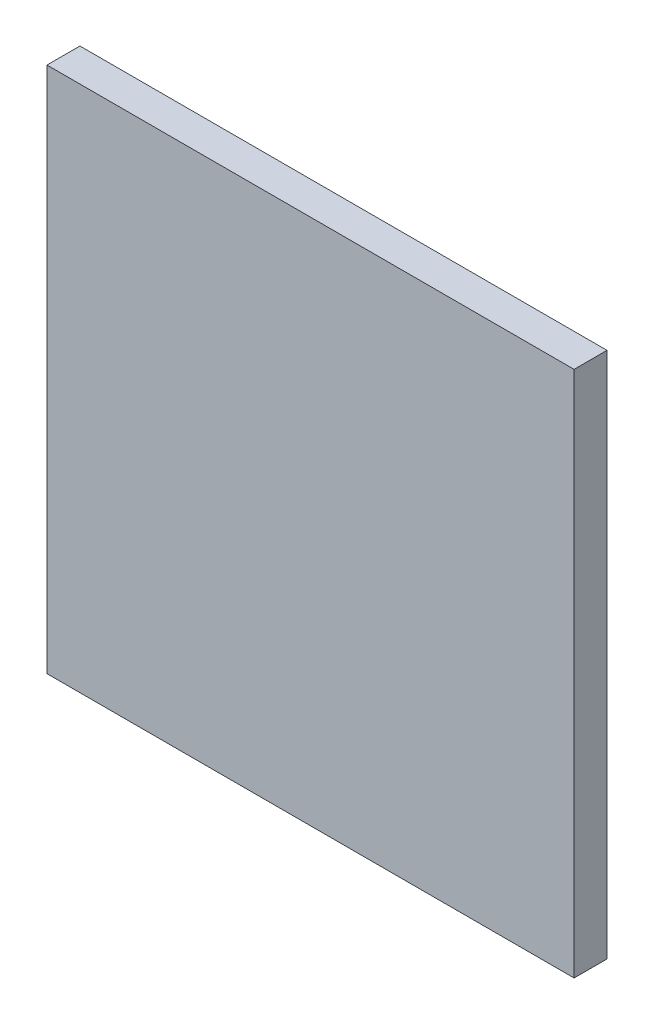
ISO-10303-21;
HEADER;
FILE_DESCRIPTION(('STEP AP214'),'2;1');
FILE_NAME('part.step','',(''),(''),'','','');
FILE_SCHEMA(('AUTOMOTIVE_DESIGN { 1 0 10303 214 1 1 1 1 }'));
ENDSEC;
DATA;
#1=APPLICATION_CONTEXT('core data for automotive mechanical design processes');
#2=APPLICATION_PROTOCOL_DEFINITION('international standard','automotive_design',2000,#1);
#3=PRODUCT_CONTEXT('',#1,'mechanical');
#4=PRODUCT('Part','Part','',(#3));
#5=PRODUCT_RELATED_PRODUCT_CATEGORY('part','',(#4));
#6=PRODUCT_DEFINITION_FORMATION('','',#4);
#7=PRODUCT_DEFINITION_CONTEXT('part definition',#1,'design');
#8=PRODUCT_DEFINITION('design','',#6,#7);
#9=PRODUCT_DEFINITION_SHAPE('','',#8);
#10=(LENGTH_UNIT() NAMED_UNIT(*) SI_UNIT(.MILLI.,.METRE.));
#11=(NAMED_UNIT(*) PLANE_ANGLE_UNIT() SI_UNIT($,.RADIAN.));
#12=(NAMED_UNIT(*) SI_UNIT($,.STERADIAN.) SOLID_ANGLE_UNIT());
#13=UNCERTAINTY_MEASURE_WITH_UNIT(LENGTH_MEASURE(1.E-05),#10,'distance_accuracy_value','');
#14=(GEOMETRIC_REPRESENTATION_CONTEXT(3) GLOBAL_UNCERTAINTY_ASSIGNED_CONTEXT((#13)) GLOBAL_UNIT_ASSIGNED_CONTEXT((#10,
#11,#12)) REPRESENTATION_CONTEXT('',''));
#15=CARTESIAN_POINT('',(0.,0.,0.));
#16=DIRECTION('',(0.,0.,1.));
#17=DIRECTION('',(1.,0.,0.));
#18=AXIS2_PLACEMENT_3D('',#15,#16,#17);
#19=CARTESIAN_POINT('',(0.,0.,1.5875));
#20=DIRECTION('',(1.,0.,0.));
#21=DIRECTION('',(0.,0.,-1.));
#22=AXIS2_PLACEMENT_3D('',#19,#20,#21);
#23=PLANE('',#22);
#24=DIRECTION('',(0.,-1.,0.));
#25=VECTOR('',#24,1.);
#26=CARTESIAN_POINT('',(0.,0.,0.));
#27=LINE('',#26,#25);
#28=CARTESIAN_POINT('',(0.,25.4,0.));
#29=VERTEX_POINT('',#28);
#30=CARTESIAN_POINT('',(0.,0.,0.));
#31=VERTEX_POINT('',#30);
#32=EDGE_CURVE('E102',#29,#31,#27,.T.);
#33=ORIENTED_EDGE('',*,*,#32,.T.);
#34=DIRECTION('',(0.,0.,-1.));
#35=VECTOR('',#34,1.);
#36=CARTESIAN_POINT('',(0.,0.,1.5875));
#37=LINE('',#36,#35);
#38=CARTESIAN_POINT('',(0.,0.,1.5875));
#39=VERTEX_POINT('',#38);
#40=EDGE_CURVE('E11',#39,#31,#37,.T.);
#41=ORIENTED_EDGE('',*,*,#40,.F.);
#42=DIRECTION('',(0.,-1.,0.));
#43=VECTOR('',#42,1.);
#44=CARTESIAN_POINT('',(0.,0.,1.5875));
#45=LINE('',#44,#43);
#46=CARTESIAN_POINT('',(0.,25.4,1.5875));
#47=VERTEX_POINT('',#46);
#48=EDGE_CURVE('E90',#47,#39,#45,.T.);
#49=ORIENTED_EDGE('',*,*,#48,.F.);
#50=DIRECTION('',(0.,0.,-1.));
#51=VECTOR('',#50,1.);
#52=CARTESIAN_POINT('',(0.,25.4,1.5875));
#53=LINE('',#52,#51);
#54=EDGE_CURVE('E98',#47,#29,#53,.T.);
#55=ORIENTED_EDGE('',*,*,#54,.T.);
#56=EDGE_LOOP('',(#33,#41,#49,#55));
#57=FACE_BOUND('',#56,.T.);
#58=ADVANCED_FACE('F39',(#57),#23,.F.);
#59=CARTESIAN_POINT('',(0.,0.,1.5875));
#60=DIRECTION('',(0.,1.,0.));
#61=DIRECTION('',(0.,0.,1.));
#62=AXIS2_PLACEMENT_3D('',#59,#60,#61);
#63=PLANE('',#62);
#64=DIRECTION('',(1.,0.,0.));
#65=VECTOR('',#64,1.);
#66=CARTESIAN_POINT('',(0.,0.,0.));
#67=LINE('',#66,#65);
#68=CARTESIAN_POINT('',(25.4,0.,0.));
#69=VERTEX_POINT('',#68);
#70=EDGE_CURVE('E94',#31,#69,#67,.T.);
#71=ORIENTED_EDGE('',*,*,#70,.T.);
#72=DIRECTION('',(0.,0.,-1.));
#73=VECTOR('',#72,1.);
#74=CARTESIAN_POINT('',(25.4,0.,1.5875));
#75=LINE('',#74,#73);
#76=CARTESIAN_POINT('',(25.4,0.,1.5875));
#77=VERTEX_POINT('',#76);
#78=EDGE_CURVE('E47',#77,#69,#75,.T.);
#79=ORIENTED_EDGE('',*,*,#78,.F.);
#80=DIRECTION('',(1.,0.,0.));
#81=VECTOR('',#80,1.);
#82=CARTESIAN_POINT('',(0.,0.,1.5875));
#83=LINE('',#82,#81);
#84=EDGE_CURVE('E85',#39,#77,#83,.T.);
#85=ORIENTED_EDGE('',*,*,#84,.F.);
#86=ORIENTED_EDGE('',*,*,#40,.T.);
#87=EDGE_LOOP('',(#71,#79,#85,#86));
#88=FACE_BOUND('',#87,.T.);
#89=ADVANCED_FACE('F93',(#88),#63,.F.);
#90=CARTESIAN_POINT('',(25.4,0.,1.5875));
#91=DIRECTION('',(-1.,0.,0.));
#92=DIRECTION('',(0.,0.,1.));
#93=AXIS2_PLACEMENT_3D('',#90,#91,#92);
#94=PLANE('',#93);
#95=DIRECTION('',(0.,1.,0.));
#96=VECTOR('',#95,1.);
#97=CARTESIAN_POINT('',(25.4,0.,0.));
#98=LINE('',#97,#96);
#99=CARTESIAN_POINT('',(25.4,25.4,0.));
#100=VERTEX_POINT('',#99);
#101=EDGE_CURVE('E72',#69,#100,#98,.T.);
#102=ORIENTED_EDGE('',*,*,#101,.T.);
#103=DIRECTION('',(0.,0.,-1.));
#104=VECTOR('',#103,1.);
#105=CARTESIAN_POINT('',(25.4,25.4,1.5875));
#106=LINE('',#105,#104);
#107=CARTESIAN_POINT('',(25.4,25.4,1.5875));
#108=VERTEX_POINT('',#107);
#109=EDGE_CURVE('E95',#108,#100,#106,.T.);
#110=ORIENTED_EDGE('',*,*,#109,.F.);
#111=DIRECTION('',(0.,1.,0.));
#112=VECTOR('',#111,1.);
#113=CARTESIAN_POINT('',(25.4,0.,1.5875));
#114=LINE('',#113,#112);
#115=EDGE_CURVE('E88',#77,#108,#114,.T.);
#116=ORIENTED_EDGE('',*,*,#115,.F.);
#117=ORIENTED_EDGE('',*,*,#78,.T.);
#118=EDGE_LOOP('',(#102,#110,#116,#117));
#119=FACE_BOUND('',#118,.T.);
#120=ADVANCED_FACE('F96',(#119),#94,.F.);
#121=CARTESIAN_POINT('',(0.,25.4,1.5875));
#122=DIRECTION('',(0.,-1.,0.));
#123=DIRECTION('',(0.,0.,-1.));
#124=AXIS2_PLACEMENT_3D('',#121,#122,#123);
#125=PLANE('',#124);
#126=DIRECTION('',(-1.,0.,0.));
#127=VECTOR('',#126,1.);
#128=CARTESIAN_POINT('',(0.,25.4,0.));
#129=LINE('',#128,#127);
#130=EDGE_CURVE('E78',#100,#29,#129,.T.);
#131=ORIENTED_EDGE('',*,*,#130,.T.);
#132=ORIENTED_EDGE('',*,*,#54,.F.);
#133=DIRECTION('',(-1.,0.,0.));
#134=VECTOR('',#133,1.);
#135=CARTESIAN_POINT('',(0.,25.4,1.5875));
#136=LINE('',#135,#134);
#137=EDGE_CURVE('E55',#108,#47,#136,.T.);
#138=ORIENTED_EDGE('',*,*,#137,.F.);
#139=ORIENTED_EDGE('',*,*,#109,.T.);
#140=EDGE_LOOP('',(#131,#132,#138,#139));
#141=FACE_BOUND('',#140,.T.);
#142=ADVANCED_FACE('F109',(#141),#125,.F.);
#143=CARTESIAN_POINT('',(0.,0.,1.5875));
#144=DIRECTION('',(0.,0.,-1.));
#145=DIRECTION('',(-1.,0.,0.));
#146=AXIS2_PLACEMENT_3D('',#143,#144,#145);
#147=PLANE('',#146);
#148=ORIENTED_EDGE('',*,*,#48,.T.);
#149=ORIENTED_EDGE('',*,*,#84,.T.);
#150=ORIENTED_EDGE('',*,*,#115,.T.);
#151=ORIENTED_EDGE('',*,*,#137,.T.);
#152=EDGE_LOOP('',(#148,#149,#150,#151));
#153=FACE_BOUND('',#152,.T.);
#154=ADVANCED_FACE('F86',(#153),#147,.F.);
#155=CARTESIAN_POINT('',(0.,0.,0.));
#156=DIRECTION('',(0.,0.,-1.));
#157=DIRECTION('',(-1.,0.,0.));
#158=AXIS2_PLACEMENT_3D('',#155,#156,#157);
#159=PLANE('',#158);
#160=ORIENTED_EDGE('',*,*,#32,.F.);
#161=ORIENTED_EDGE('',*,*,#130,.F.);
#162=ORIENTED_EDGE('',*,*,#101,.F.);
#163=ORIENTED_EDGE('',*,*,#70,.F.);
#164=EDGE_LOOP('',(#160,#161,#162,#163));
#165=FACE_BOUND('',#164,.T.);
#166=ADVANCED_FACE('F112',(#165),#159,.T.);
#167=CLOSED_SHELL('',(#58,#89,#120,#142,#154,#166));
#168=MANIFOLD_SOLID_BREP('B2',#167);
#169=ADVANCED_BREP_SHAPE_REPRESENTATION('',(#18,#168),#14);
#170=SHAPE_DEFINITION_REPRESENTATION(#9,#169);
ENDSEC;
END-ISO-10303-21;
